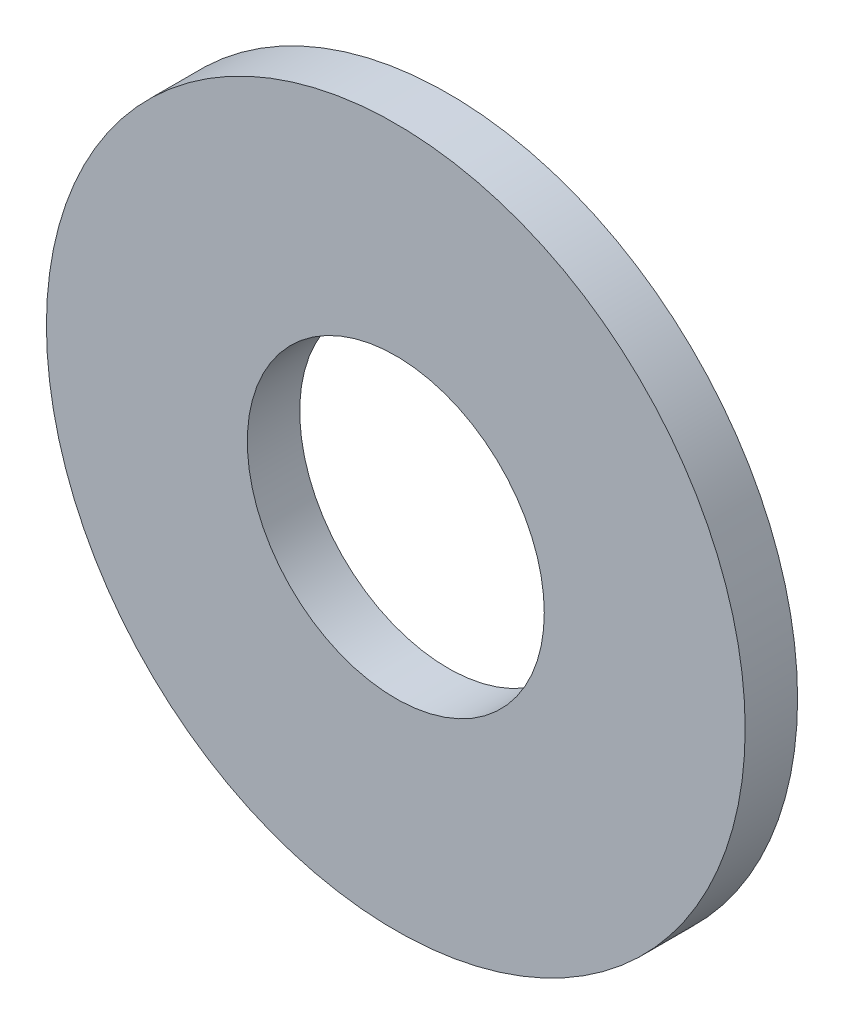
ISO-10303-21;
HEADER;
FILE_DESCRIPTION(('STEP AP214'),'2;1');
FILE_NAME('part.step','',(''),(''),'','','');
FILE_SCHEMA(('AUTOMOTIVE_DESIGN { 1 0 10303 214 1 1 1 1 }'));
ENDSEC;
DATA;
#1=APPLICATION_CONTEXT('core data for automotive mechanical design processes');
#2=APPLICATION_PROTOCOL_DEFINITION('international standard','automotive_design',2000,#1);
#3=PRODUCT_CONTEXT('',#1,'mechanical');
#4=PRODUCT('Part','Part','',(#3));
#5=PRODUCT_RELATED_PRODUCT_CATEGORY('part','',(#4));
#6=PRODUCT_DEFINITION_FORMATION('','',#4);
#7=PRODUCT_DEFINITION_CONTEXT('part definition',#1,'design');
#8=PRODUCT_DEFINITION('design','',#6,#7);
#9=PRODUCT_DEFINITION_SHAPE('','',#8);
#10=(LENGTH_UNIT() NAMED_UNIT(*) SI_UNIT(.MILLI.,.METRE.));
#11=(NAMED_UNIT(*) PLANE_ANGLE_UNIT() SI_UNIT($,.RADIAN.));
#12=(NAMED_UNIT(*) SI_UNIT($,.STERADIAN.) SOLID_ANGLE_UNIT());
#13=UNCERTAINTY_MEASURE_WITH_UNIT(LENGTH_MEASURE(1.E-05),#10,'distance_accuracy_value','');
#14=(GEOMETRIC_REPRESENTATION_CONTEXT(3) GLOBAL_UNCERTAINTY_ASSIGNED_CONTEXT((#13)) GLOBAL_UNIT_ASSIGNED_CONTEXT((#10,
#11,#12)) REPRESENTATION_CONTEXT('',''));
#15=CARTESIAN_POINT('',(0.,0.,0.));
#16=DIRECTION('',(0.,0.,1.));
#17=DIRECTION('',(1.,0.,0.));
#18=AXIS2_PLACEMENT_3D('',#15,#16,#17);
#19=CARTESIAN_POINT('',(0.,0.,0.3));
#20=DIRECTION('',(0.,0.,1.));
#21=DIRECTION('',(1.,0.,0.));
#22=AXIS2_PLACEMENT_3D('',#19,#20,#21);
#23=PLANE('',#22);
#24=CARTESIAN_POINT('',(0.,0.,0.3));
#25=DIRECTION('',(0.,0.,1.));
#26=DIRECTION('',(1.,0.,0.));
#27=AXIS2_PLACEMENT_3D('',#24,#25,#26);
#28=CIRCLE('',#27,2.);
#29=CARTESIAN_POINT('',(2.,0.,0.3));
#30=VERTEX_POINT('',#29);
#31=EDGE_CURVE('E10',#30,#30,#28,.T.);
#32=ORIENTED_EDGE('',*,*,#31,.T.);
#33=EDGE_LOOP('',(#32));
#34=FACE_BOUND('',#33,.T.);
#35=CARTESIAN_POINT('',(0.,0.,0.3));
#36=DIRECTION('',(0.,0.,1.));
#37=DIRECTION('',(1.,0.,0.));
#38=AXIS2_PLACEMENT_3D('',#35,#36,#37);
#39=CIRCLE('',#38,0.85);
#40=CARTESIAN_POINT('',(0.85,0.,0.3));
#41=VERTEX_POINT('',#40);
#42=EDGE_CURVE('E49',#41,#41,#39,.T.);
#43=ORIENTED_EDGE('',*,*,#42,.F.);
#44=EDGE_LOOP('',(#43));
#45=FACE_BOUND('',#44,.T.);
#46=ADVANCED_FACE('F39',(#34,#45),#23,.T.);
#47=CARTESIAN_POINT('',(0.,0.,0.));
#48=DIRECTION('',(0.,0.,1.));
#49=DIRECTION('',(1.,0.,0.));
#50=AXIS2_PLACEMENT_3D('',#47,#48,#49);
#51=PLANE('',#50);
#52=CARTESIAN_POINT('',(0.,0.,0.));
#53=DIRECTION('',(0.,0.,1.));
#54=DIRECTION('',(1.,0.,0.));
#55=AXIS2_PLACEMENT_3D('',#52,#53,#54);
#56=CIRCLE('',#55,2.);
#57=CARTESIAN_POINT('',(2.,0.,0.));
#58=VERTEX_POINT('',#57);
#59=EDGE_CURVE('E43',#58,#58,#56,.T.);
#60=ORIENTED_EDGE('',*,*,#59,.F.);
#61=EDGE_LOOP('',(#60));
#62=FACE_BOUND('',#61,.T.);
#63=CARTESIAN_POINT('',(0.,0.,0.));
#64=DIRECTION('',(0.,0.,1.));
#65=DIRECTION('',(1.,0.,0.));
#66=AXIS2_PLACEMENT_3D('',#63,#64,#65);
#67=CIRCLE('',#66,0.85);
#68=CARTESIAN_POINT('',(0.85,0.,0.));
#69=VERTEX_POINT('',#68);
#70=EDGE_CURVE('E55',#69,#69,#67,.T.);
#71=ORIENTED_EDGE('',*,*,#70,.T.);
#72=EDGE_LOOP('',(#71));
#73=FACE_BOUND('',#72,.T.);
#74=ADVANCED_FACE('F61',(#62,#73),#51,.F.);
#75=CARTESIAN_POINT('',(0.,0.,0.3));
#76=DIRECTION('',(0.,0.,-1.));
#77=DIRECTION('',(-1.,0.,0.));
#78=AXIS2_PLACEMENT_3D('',#75,#76,#77);
#79=CYLINDRICAL_SURFACE('',#78,2.);
#80=ORIENTED_EDGE('',*,*,#31,.F.);
#81=EDGE_LOOP('',(#80));
#82=FACE_BOUND('',#81,.T.);
#83=ORIENTED_EDGE('',*,*,#59,.T.);
#84=EDGE_LOOP('',(#83));
#85=FACE_BOUND('',#84,.T.);
#86=ADVANCED_FACE('F41',(#82,#85),#79,.T.);
#87=CARTESIAN_POINT('',(0.,0.,0.3));
#88=DIRECTION('',(0.,0.,-1.));
#89=DIRECTION('',(-1.,0.,0.));
#90=AXIS2_PLACEMENT_3D('',#87,#88,#89);
#91=CYLINDRICAL_SURFACE('',#90,0.85);
#92=ORIENTED_EDGE('',*,*,#42,.T.);
#93=EDGE_LOOP('',(#92));
#94=FACE_BOUND('',#93,.T.);
#95=ORIENTED_EDGE('',*,*,#70,.F.);
#96=EDGE_LOOP('',(#95));
#97=FACE_BOUND('',#96,.T.);
#98=ADVANCED_FACE('F59',(#94,#97),#91,.F.);
#99=CLOSED_SHELL('',(#46,#74,#86,#98));
#100=MANIFOLD_SOLID_BREP('B2',#99);
#101=ADVANCED_BREP_SHAPE_REPRESENTATION('',(#18,#100),#14);
#102=SHAPE_DEFINITION_REPRESENTATION(#9,#101);
ENDSEC;
END-ISO-10303-21;
